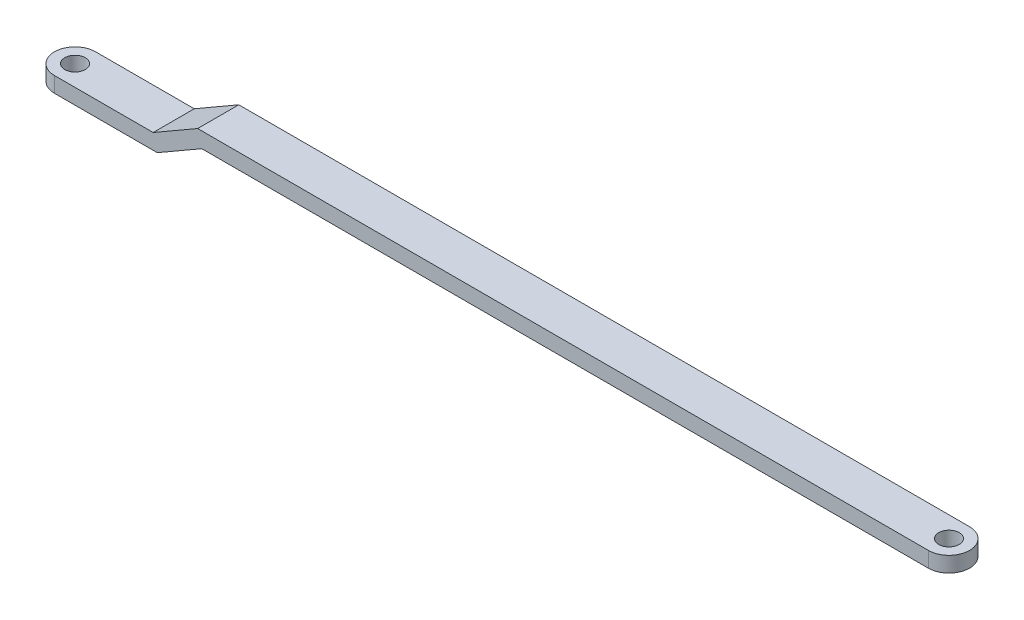
ISO-10303-21;
HEADER;
FILE_DESCRIPTION(('STEP AP214'),'2;1');
FILE_NAME('part.step','',(''),(''),'','','');
FILE_SCHEMA(('AUTOMOTIVE_DESIGN { 1 0 10303 214 1 1 1 1 }'));
ENDSEC;
DATA;
#1=APPLICATION_CONTEXT('core data for automotive mechanical design processes');
#2=APPLICATION_PROTOCOL_DEFINITION('international standard','automotive_design',2000,#1);
#3=PRODUCT_CONTEXT('',#1,'mechanical');
#4=PRODUCT('Part','Part','',(#3));
#5=PRODUCT_RELATED_PRODUCT_CATEGORY('part','',(#4));
#6=PRODUCT_DEFINITION_FORMATION('','',#4);
#7=PRODUCT_DEFINITION_CONTEXT('part definition',#1,'design');
#8=PRODUCT_DEFINITION('design','',#6,#7);
#9=PRODUCT_DEFINITION_SHAPE('','',#8);
#10=(LENGTH_UNIT() NAMED_UNIT(*) SI_UNIT(.MILLI.,.METRE.));
#11=(NAMED_UNIT(*) PLANE_ANGLE_UNIT() SI_UNIT($,.RADIAN.));
#12=(NAMED_UNIT(*) SI_UNIT($,.STERADIAN.) SOLID_ANGLE_UNIT());
#13=UNCERTAINTY_MEASURE_WITH_UNIT(LENGTH_MEASURE(1.E-05),#10,'distance_accuracy_value','');
#14=(GEOMETRIC_REPRESENTATION_CONTEXT(3) GLOBAL_UNCERTAINTY_ASSIGNED_CONTEXT((#13)) GLOBAL_UNIT_ASSIGNED_CONTEXT((#10,
#11,#12)) REPRESENTATION_CONTEXT('',''));
#15=CARTESIAN_POINT('',(0.,0.,0.));
#16=DIRECTION('',(0.,0.,1.));
#17=DIRECTION('',(1.,0.,0.));
#18=AXIS2_PLACEMENT_3D('',#15,#16,#17);
#19=CARTESIAN_POINT('',(170.,8.,0.));
#20=DIRECTION('',(0.,-1.,0.));
#21=DIRECTION('',(0.,0.,-1.));
#22=AXIS2_PLACEMENT_3D('',#19,#20,#21);
#23=CYLINDRICAL_SURFACE('',#22,2.);
#24=CARTESIAN_POINT('',(170.,8.,0.));
#25=DIRECTION('',(0.,1.,0.));
#26=DIRECTION('',(0.,0.,1.));
#27=AXIS2_PLACEMENT_3D('',#24,#25,#26);
#28=CIRCLE('',#27,2.);
#29=CARTESIAN_POINT('',(170.,8.,2.));
#30=VERTEX_POINT('',#29);
#31=EDGE_CURVE('E194',#30,#30,#28,.T.);
#32=ORIENTED_EDGE('',*,*,#31,.T.);
#33=EDGE_LOOP('',(#32));
#34=FACE_BOUND('',#33,.T.);
#35=CARTESIAN_POINT('',(170.,5.,0.));
#36=DIRECTION('',(0.,-1.,0.));
#37=DIRECTION('',(0.,0.,-1.));
#38=AXIS2_PLACEMENT_3D('',#35,#36,#37);
#39=CIRCLE('',#38,2.);
#40=CARTESIAN_POINT('',(170.,5.,-2.));
#41=VERTEX_POINT('',#40);
#42=EDGE_CURVE('E187',#41,#41,#39,.T.);
#43=ORIENTED_EDGE('',*,*,#42,.T.);
#44=EDGE_LOOP('',(#43));
#45=FACE_BOUND('',#44,.T.);
#46=ADVANCED_FACE('F95',(#34,#45),#23,.F.);
#47=CARTESIAN_POINT('',(0.,0.,0.));
#48=DIRECTION('',(0.,1.,0.));
#49=DIRECTION('',(0.,0.,1.));
#50=AXIS2_PLACEMENT_3D('',#47,#48,#49);
#51=PLANE('',#50);
#52=CARTESIAN_POINT('',(0.,0.,0.));
#53=DIRECTION('',(0.,1.,0.));
#54=DIRECTION('',(0.,0.,1.));
#55=AXIS2_PLACEMENT_3D('',#52,#53,#54);
#56=CIRCLE('',#55,2.);
#57=CARTESIAN_POINT('',(0.,0.,2.));
#58=VERTEX_POINT('',#57);
#59=EDGE_CURVE('E198',#58,#58,#56,.T.);
#60=ORIENTED_EDGE('',*,*,#59,.T.);
#61=EDGE_LOOP('',(#60));
#62=FACE_BOUND('',#61,.T.);
#63=DIRECTION('',(0.,0.,1.));
#64=VECTOR('',#63,1.);
#65=CARTESIAN_POINT('',(20.,0.,-4.));
#66=LINE('',#65,#64);
#67=CARTESIAN_POINT('',(20.,0.,-4.));
#68=VERTEX_POINT('',#67);
#69=CARTESIAN_POINT('',(20.,0.,4.));
#70=VERTEX_POINT('',#69);
#71=EDGE_CURVE('E160',#68,#70,#66,.T.);
#72=ORIENTED_EDGE('',*,*,#71,.T.);
#73=DIRECTION('',(-1.,0.,0.));
#74=VECTOR('',#73,1.);
#75=CARTESIAN_POINT('',(0.,0.,4.));
#76=LINE('',#75,#74);
#77=CARTESIAN_POINT('',(0.,0.,4.));
#78=VERTEX_POINT('',#77);
#79=EDGE_CURVE('E189',#70,#78,#76,.T.);
#80=ORIENTED_EDGE('',*,*,#79,.T.);
#81=CARTESIAN_POINT('',(0.,0.,0.));
#82=DIRECTION('',(0.,1.,0.));
#83=DIRECTION('',(0.,0.,1.));
#84=AXIS2_PLACEMENT_3D('',#81,#82,#83);
#85=CIRCLE('',#84,4.);
#86=CARTESIAN_POINT('',(0.,0.,-4.));
#87=VERTEX_POINT('',#86);
#88=EDGE_CURVE('E186',#87,#78,#85,.T.);
#89=ORIENTED_EDGE('',*,*,#88,.F.);
#90=DIRECTION('',(1.,0.,0.));
#91=VECTOR('',#90,1.);
#92=CARTESIAN_POINT('',(0.,0.,-4.));
#93=LINE('',#92,#91);
#94=EDGE_CURVE('E180',#87,#68,#93,.T.);
#95=ORIENTED_EDGE('',*,*,#94,.T.);
#96=EDGE_LOOP('',(#72,#80,#89,#95));
#97=FACE_BOUND('',#96,.T.);
#98=ADVANCED_FACE('F184',(#62,#97),#51,.F.);
#99=CARTESIAN_POINT('',(170.,8.,0.));
#100=DIRECTION('',(0.,-1.,0.));
#101=DIRECTION('',(0.,0.,-1.));
#102=AXIS2_PLACEMENT_3D('',#99,#100,#101);
#103=CYLINDRICAL_SURFACE('',#102,3.99999999999999);
#104=CARTESIAN_POINT('',(170.,5.,0.));
#105=DIRECTION('',(0.,-1.,0.));
#106=DIRECTION('',(0.,0.,-1.));
#107=AXIS2_PLACEMENT_3D('',#104,#105,#106);
#108=CIRCLE('',#107,3.99999999999999);
#109=CARTESIAN_POINT('',(170.,5.,-4.));
#110=VERTEX_POINT('',#109);
#111=CARTESIAN_POINT('',(170.,5.,4.));
#112=VERTEX_POINT('',#111);
#113=EDGE_CURVE('E119',#110,#112,#108,.T.);
#114=ORIENTED_EDGE('',*,*,#113,.F.);
#115=DIRECTION('',(0.,-1.,0.));
#116=VECTOR('',#115,1.);
#117=CARTESIAN_POINT('',(170.,8.,-4.));
#118=LINE('',#117,#116);
#119=CARTESIAN_POINT('',(170.,8.,-4.));
#120=VERTEX_POINT('',#119);
#121=EDGE_CURVE('E12',#120,#110,#118,.T.);
#122=ORIENTED_EDGE('',*,*,#121,.F.);
#123=CARTESIAN_POINT('',(170.,8.,0.));
#124=DIRECTION('',(0.,1.,0.));
#125=DIRECTION('',(0.,0.,1.));
#126=AXIS2_PLACEMENT_3D('',#123,#124,#125);
#127=CIRCLE('',#126,3.99999999999999);
#128=CARTESIAN_POINT('',(170.,8.,4.));
#129=VERTEX_POINT('',#128);
#130=EDGE_CURVE('E201',#129,#120,#127,.T.);
#131=ORIENTED_EDGE('',*,*,#130,.F.);
#132=DIRECTION('',(0.,-1.,0.));
#133=VECTOR('',#132,1.);
#134=CARTESIAN_POINT('',(170.,8.,4.));
#135=LINE('',#134,#133);
#136=EDGE_CURVE('E202',#129,#112,#135,.T.);
#137=ORIENTED_EDGE('',*,*,#136,.T.);
#138=EDGE_LOOP('',(#114,#122,#131,#137));
#139=FACE_BOUND('',#138,.T.);
#140=ADVANCED_FACE('F97',(#139),#103,.T.);
#141=CARTESIAN_POINT('',(0.,8.,-4.));
#142=DIRECTION('',(0.,0.,-1.));
#143=DIRECTION('',(-1.,0.,0.));
#144=AXIS2_PLACEMENT_3D('',#141,#142,#143);
#145=PLANE('',#144);
#146=DIRECTION('',(1.,0.,0.));
#147=VECTOR('',#146,1.);
#148=CARTESIAN_POINT('',(0.,5.,-4.));
#149=LINE('',#148,#147);
#150=CARTESIAN_POINT('',(28.6602540378443,5.,-4.));
#151=VERTEX_POINT('',#150);
#152=EDGE_CURVE('E173',#151,#110,#149,.T.);
#153=ORIENTED_EDGE('',*,*,#152,.F.);
#154=DIRECTION('',(0.866025403784438,0.500000000000001,0.));
#155=VECTOR('',#154,1.);
#156=CARTESIAN_POINT('',(5.00000000000002,-8.6602540378444,-4.));
#157=LINE('',#156,#155);
#158=EDGE_CURVE('E164',#68,#151,#157,.T.);
#159=ORIENTED_EDGE('',*,*,#158,.F.);
#160=ORIENTED_EDGE('',*,*,#94,.F.);
#161=DIRECTION('',(0.,-1.,0.));
#162=VECTOR('',#161,1.);
#163=CARTESIAN_POINT('',(0.,8.,-4.));
#164=LINE('',#163,#162);
#165=CARTESIAN_POINT('',(0.,2.99999999999998,-4.));
#166=VERTEX_POINT('',#165);
#167=EDGE_CURVE('E104',#166,#87,#164,.T.);
#168=ORIENTED_EDGE('',*,*,#167,.F.);
#169=DIRECTION('',(-1.,0.,0.));
#170=VECTOR('',#169,1.);
#171=CARTESIAN_POINT('',(0.,2.99999999999998,-4.));
#172=LINE('',#171,#170);
#173=CARTESIAN_POINT('',(19.1961524227066,2.99999999999998,-4.));
#174=VERTEX_POINT('',#173);
#175=EDGE_CURVE('E214',#174,#166,#172,.T.);
#176=ORIENTED_EDGE('',*,*,#175,.F.);
#177=DIRECTION('',(0.866025403784438,0.500000000000001,0.));
#178=VECTOR('',#177,1.);
#179=CARTESIAN_POINT('',(3.50000000000002,-6.06217782649108,-4.));
#180=LINE('',#179,#178);
#181=CARTESIAN_POINT('',(27.856406460551,8.,-4.));
#182=VERTEX_POINT('',#181);
#183=EDGE_CURVE('E216',#174,#182,#180,.T.);
#184=ORIENTED_EDGE('',*,*,#183,.T.);
#185=DIRECTION('',(1.,0.,0.));
#186=VECTOR('',#185,1.);
#187=CARTESIAN_POINT('',(0.,8.,-4.));
#188=LINE('',#187,#186);
#189=EDGE_CURVE('E234',#182,#120,#188,.T.);
#190=ORIENTED_EDGE('',*,*,#189,.T.);
#191=ORIENTED_EDGE('',*,*,#121,.T.);
#192=EDGE_LOOP('',(#153,#159,#160,#168,#176,#184,#190,#191));
#193=FACE_BOUND('',#192,.T.);
#194=ADVANCED_FACE('F178',(#193),#145,.T.);
#195=CARTESIAN_POINT('',(0.,8.,0.));
#196=DIRECTION('',(0.,-1.,0.));
#197=DIRECTION('',(0.,0.,-1.));
#198=AXIS2_PLACEMENT_3D('',#195,#196,#197);
#199=CYLINDRICAL_SURFACE('',#198,4.);
#200=CARTESIAN_POINT('',(0.,2.99999999999998,0.));
#201=DIRECTION('',(0.,1.,0.));
#202=DIRECTION('',(-1.,0.,0.));
#203=AXIS2_PLACEMENT_3D('',#200,#201,#202);
#204=CIRCLE('',#203,4.);
#205=CARTESIAN_POINT('',(0.,2.99999999999998,4.));
#206=VERTEX_POINT('',#205);
#207=EDGE_CURVE('E210',#166,#206,#204,.T.);
#208=ORIENTED_EDGE('',*,*,#207,.F.);
#209=ORIENTED_EDGE('',*,*,#167,.T.);
#210=ORIENTED_EDGE('',*,*,#88,.T.);
#211=DIRECTION('',(0.,-1.,0.));
#212=VECTOR('',#211,1.);
#213=CARTESIAN_POINT('',(0.,8.,4.));
#214=LINE('',#213,#212);
#215=EDGE_CURVE('E205',#206,#78,#214,.T.);
#216=ORIENTED_EDGE('',*,*,#215,.F.);
#217=EDGE_LOOP('',(#208,#209,#210,#216));
#218=FACE_BOUND('',#217,.T.);
#219=ADVANCED_FACE('F208',(#218),#199,.T.);
#220=CARTESIAN_POINT('',(0.,8.,4.));
#221=DIRECTION('',(0.,0.,1.));
#222=DIRECTION('',(1.,0.,0.));
#223=AXIS2_PLACEMENT_3D('',#220,#221,#222);
#224=PLANE('',#223);
#225=ORIENTED_EDGE('',*,*,#79,.F.);
#226=DIRECTION('',(0.866025403784438,0.500000000000001,0.));
#227=VECTOR('',#226,1.);
#228=CARTESIAN_POINT('',(5.00000000000002,-8.6602540378444,4.));
#229=LINE('',#228,#227);
#230=CARTESIAN_POINT('',(28.6602540378443,5.,4.));
#231=VERTEX_POINT('',#230);
#232=EDGE_CURVE('E167',#70,#231,#229,.T.);
#233=ORIENTED_EDGE('',*,*,#232,.T.);
#234=DIRECTION('',(1.,0.,0.));
#235=VECTOR('',#234,1.);
#236=CARTESIAN_POINT('',(0.,5.,4.));
#237=LINE('',#236,#235);
#238=EDGE_CURVE('E181',#231,#112,#237,.T.);
#239=ORIENTED_EDGE('',*,*,#238,.T.);
#240=ORIENTED_EDGE('',*,*,#136,.F.);
#241=DIRECTION('',(-1.,0.,0.));
#242=VECTOR('',#241,1.);
#243=CARTESIAN_POINT('',(0.,8.,4.));
#244=LINE('',#243,#242);
#245=CARTESIAN_POINT('',(27.856406460551,8.,4.));
#246=VERTEX_POINT('',#245);
#247=EDGE_CURVE('E235',#129,#246,#244,.T.);
#248=ORIENTED_EDGE('',*,*,#247,.T.);
#249=DIRECTION('',(0.866025403784438,0.500000000000001,0.));
#250=VECTOR('',#249,1.);
#251=CARTESIAN_POINT('',(3.50000000000002,-6.06217782649108,4.));
#252=LINE('',#251,#250);
#253=CARTESIAN_POINT('',(19.1961524227066,2.99999999999998,4.));
#254=VERTEX_POINT('',#253);
#255=EDGE_CURVE('E218',#254,#246,#252,.T.);
#256=ORIENTED_EDGE('',*,*,#255,.F.);
#257=DIRECTION('',(-1.,0.,0.));
#258=VECTOR('',#257,1.);
#259=CARTESIAN_POINT('',(0.,2.99999999999998,4.));
#260=LINE('',#259,#258);
#261=EDGE_CURVE('E111',#254,#206,#260,.T.);
#262=ORIENTED_EDGE('',*,*,#261,.T.);
#263=ORIENTED_EDGE('',*,*,#215,.T.);
#264=EDGE_LOOP('',(#225,#233,#239,#240,#248,#256,#262,#263));
#265=FACE_BOUND('',#264,.T.);
#266=ADVANCED_FACE('F258',(#265),#224,.T.);
#267=CARTESIAN_POINT('',(0.,8.,0.));
#268=DIRECTION('',(0.,-1.,0.));
#269=DIRECTION('',(0.,0.,-1.));
#270=AXIS2_PLACEMENT_3D('',#267,#268,#269);
#271=CYLINDRICAL_SURFACE('',#270,2.);
#272=ORIENTED_EDGE('',*,*,#59,.F.);
#273=EDGE_LOOP('',(#272));
#274=FACE_BOUND('',#273,.T.);
#275=CARTESIAN_POINT('',(0.,2.99999999999998,0.));
#276=DIRECTION('',(0.,1.,0.));
#277=DIRECTION('',(-1.,0.,0.));
#278=AXIS2_PLACEMENT_3D('',#275,#276,#277);
#279=CIRCLE('',#278,2.);
#280=CARTESIAN_POINT('',(-2.,2.99999999999998,0.));
#281=VERTEX_POINT('',#280);
#282=EDGE_CURVE('E99',#281,#281,#279,.T.);
#283=ORIENTED_EDGE('',*,*,#282,.T.);
#284=EDGE_LOOP('',(#283));
#285=FACE_BOUND('',#284,.T.);
#286=ADVANCED_FACE('F248',(#274,#285),#271,.F.);
#287=CARTESIAN_POINT('',(0.,8.,0.));
#288=DIRECTION('',(0.,1.,0.));
#289=DIRECTION('',(0.,0.,1.));
#290=AXIS2_PLACEMENT_3D('',#287,#288,#289);
#291=PLANE('',#290);
#292=DIRECTION('',(0.,0.,1.));
#293=VECTOR('',#292,1.);
#294=CARTESIAN_POINT('',(27.856406460551,8.,-4.));
#295=LINE('',#294,#293);
#296=EDGE_CURVE('E226',#182,#246,#295,.T.);
#297=ORIENTED_EDGE('',*,*,#296,.T.);
#298=ORIENTED_EDGE('',*,*,#247,.F.);
#299=ORIENTED_EDGE('',*,*,#130,.T.);
#300=ORIENTED_EDGE('',*,*,#189,.F.);
#301=EDGE_LOOP('',(#297,#298,#299,#300));
#302=FACE_BOUND('',#301,.T.);
#303=ORIENTED_EDGE('',*,*,#31,.F.);
#304=EDGE_LOOP('',(#303));
#305=FACE_BOUND('',#304,.T.);
#306=ADVANCED_FACE('F245',(#302,#305),#291,.T.);
#307=CARTESIAN_POINT('',(0.,2.99999999999998,-4.));
#308=DIRECTION('',(0.,1.,0.));
#309=DIRECTION('',(-1.,0.,0.));
#310=AXIS2_PLACEMENT_3D('',#307,#308,#309);
#311=PLANE('',#310);
#312=ORIENTED_EDGE('',*,*,#282,.F.);
#313=EDGE_LOOP('',(#312));
#314=FACE_BOUND('',#313,.T.);
#315=ORIENTED_EDGE('',*,*,#207,.T.);
#316=ORIENTED_EDGE('',*,*,#261,.F.);
#317=DIRECTION('',(0.,0.,1.));
#318=VECTOR('',#317,1.);
#319=CARTESIAN_POINT('',(19.1961524227066,2.99999999999998,-4.));
#320=LINE('',#319,#318);
#321=EDGE_CURVE('E220',#174,#254,#320,.T.);
#322=ORIENTED_EDGE('',*,*,#321,.F.);
#323=ORIENTED_EDGE('',*,*,#175,.T.);
#324=EDGE_LOOP('',(#315,#316,#322,#323));
#325=FACE_BOUND('',#324,.T.);
#326=ADVANCED_FACE('F247',(#314,#325),#311,.T.);
#327=CARTESIAN_POINT('',(3.50000000000002,-6.06217782649108,-4.));
#328=DIRECTION('',(0.500000000000001,-0.866025403784438,0.));
#329=DIRECTION('',(0.866025403784438,0.500000000000001,0.));
#330=AXIS2_PLACEMENT_3D('',#327,#328,#329);
#331=PLANE('',#330);
#332=ORIENTED_EDGE('',*,*,#255,.T.);
#333=ORIENTED_EDGE('',*,*,#296,.F.);
#334=ORIENTED_EDGE('',*,*,#183,.F.);
#335=ORIENTED_EDGE('',*,*,#321,.T.);
#336=EDGE_LOOP('',(#332,#333,#334,#335));
#337=FACE_BOUND('',#336,.T.);
#338=ADVANCED_FACE('F255',(#337),#331,.F.);
#339=CARTESIAN_POINT('',(0.,5.,-4.));
#340=DIRECTION('',(0.,-1.,0.));
#341=DIRECTION('',(0.,0.,-1.));
#342=AXIS2_PLACEMENT_3D('',#339,#340,#341);
#343=PLANE('',#342);
#344=ORIENTED_EDGE('',*,*,#42,.F.);
#345=EDGE_LOOP('',(#344));
#346=FACE_BOUND('',#345,.T.);
#347=ORIENTED_EDGE('',*,*,#113,.T.);
#348=ORIENTED_EDGE('',*,*,#238,.F.);
#349=DIRECTION('',(0.,0.,1.));
#350=VECTOR('',#349,1.);
#351=CARTESIAN_POINT('',(28.6602540378443,5.,-4.));
#352=LINE('',#351,#350);
#353=EDGE_CURVE('E172',#151,#231,#352,.T.);
#354=ORIENTED_EDGE('',*,*,#353,.F.);
#355=ORIENTED_EDGE('',*,*,#152,.T.);
#356=EDGE_LOOP('',(#347,#348,#354,#355));
#357=FACE_BOUND('',#356,.T.);
#358=ADVANCED_FACE('F285',(#346,#357),#343,.T.);
#359=CARTESIAN_POINT('',(5.00000000000002,-8.6602540378444,-4.));
#360=DIRECTION('',(0.500000000000001,-0.866025403784438,0.));
#361=DIRECTION('',(0.866025403784438,0.500000000000001,0.));
#362=AXIS2_PLACEMENT_3D('',#359,#360,#361);
#363=PLANE('',#362);
#364=ORIENTED_EDGE('',*,*,#232,.F.);
#365=ORIENTED_EDGE('',*,*,#71,.F.);
#366=ORIENTED_EDGE('',*,*,#158,.T.);
#367=ORIENTED_EDGE('',*,*,#353,.T.);
#368=EDGE_LOOP('',(#364,#365,#366,#367));
#369=FACE_BOUND('',#368,.T.);
#370=ADVANCED_FACE('F162',(#369),#363,.T.);
#371=CLOSED_SHELL('',(#46,#98,#140,#194,#219,#266,#286,#306,#326,#338,#358,#370));
#372=MANIFOLD_SOLID_BREP('B2',#371);
#373=ADVANCED_BREP_SHAPE_REPRESENTATION('',(#18,#372),#14);
#374=SHAPE_DEFINITION_REPRESENTATION(#9,#373);
ENDSEC;
END-ISO-10303-21;
